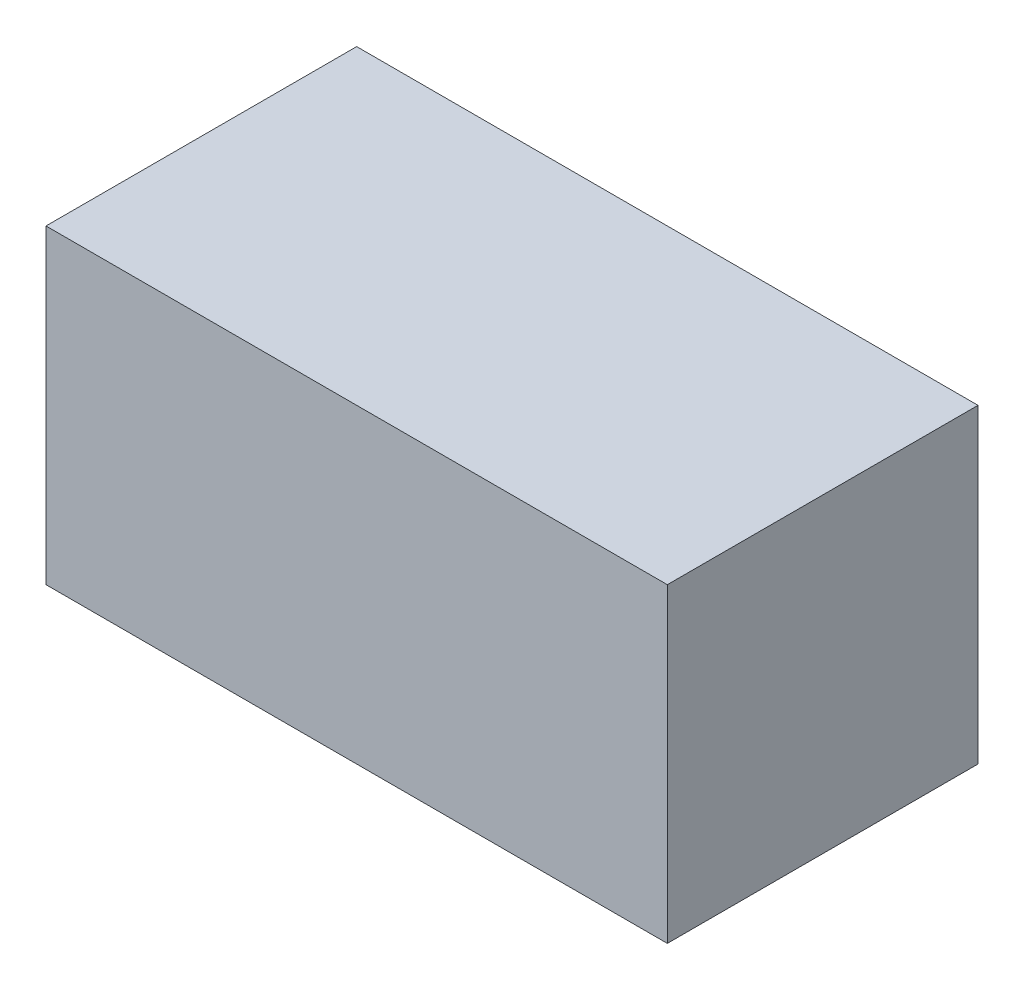
ISO-10303-21;
HEADER;
FILE_DESCRIPTION(('STEP AP214'),'2;1');
FILE_NAME('part.step','',(''),(''),'','','');
FILE_SCHEMA(('AUTOMOTIVE_DESIGN { 1 0 10303 214 1 1 1 1 }'));
ENDSEC;
DATA;
#1=APPLICATION_CONTEXT('core data for automotive mechanical design processes');
#2=APPLICATION_PROTOCOL_DEFINITION('international standard','automotive_design',2000,#1);
#3=PRODUCT_CONTEXT('',#1,'mechanical');
#4=PRODUCT('Part','Part','',(#3));
#5=PRODUCT_RELATED_PRODUCT_CATEGORY('part','',(#4));
#6=PRODUCT_DEFINITION_FORMATION('','',#4);
#7=PRODUCT_DEFINITION_CONTEXT('part definition',#1,'design');
#8=PRODUCT_DEFINITION('design','',#6,#7);
#9=PRODUCT_DEFINITION_SHAPE('','',#8);
#10=(LENGTH_UNIT() NAMED_UNIT(*) SI_UNIT(.MILLI.,.METRE.));
#11=(NAMED_UNIT(*) PLANE_ANGLE_UNIT() SI_UNIT($,.RADIAN.));
#12=(NAMED_UNIT(*) SI_UNIT($,.STERADIAN.) SOLID_ANGLE_UNIT());
#13=UNCERTAINTY_MEASURE_WITH_UNIT(LENGTH_MEASURE(1.E-05),#10,'distance_accuracy_value','');
#14=(GEOMETRIC_REPRESENTATION_CONTEXT(3) GLOBAL_UNCERTAINTY_ASSIGNED_CONTEXT((#13)) GLOBAL_UNIT_ASSIGNED_CONTEXT((#10,
#11,#12)) REPRESENTATION_CONTEXT('',''));
#15=CARTESIAN_POINT('',(0.,0.,0.));
#16=DIRECTION('',(0.,0.,1.));
#17=DIRECTION('',(1.,0.,0.));
#18=AXIS2_PLACEMENT_3D('',#15,#16,#17);
#19=CARTESIAN_POINT('',(0.,20.,10.));
#20=DIRECTION('',(1.,0.,0.));
#21=DIRECTION('',(0.,0.,-1.));
#22=AXIS2_PLACEMENT_3D('',#19,#20,#21);
#23=PLANE('',#22);
#24=DIRECTION('',(0.,-1.,0.));
#25=VECTOR('',#24,1.);
#26=CARTESIAN_POINT('',(0.,20.,-10.));
#27=LINE('',#26,#25);
#28=CARTESIAN_POINT('',(0.,20.,-10.));
#29=VERTEX_POINT('',#28);
#30=CARTESIAN_POINT('',(0.,0.,-10.));
#31=VERTEX_POINT('',#30);
#32=EDGE_CURVE('E104',#29,#31,#27,.T.);
#33=ORIENTED_EDGE('',*,*,#32,.T.);
#34=DIRECTION('',(0.,0.,-1.));
#35=VECTOR('',#34,1.);
#36=CARTESIAN_POINT('',(0.,0.,10.));
#37=LINE('',#36,#35);
#38=CARTESIAN_POINT('',(0.,0.,10.));
#39=VERTEX_POINT('',#38);
#40=EDGE_CURVE('E11',#39,#31,#37,.T.);
#41=ORIENTED_EDGE('',*,*,#40,.F.);
#42=DIRECTION('',(0.,-1.,0.));
#43=VECTOR('',#42,1.);
#44=CARTESIAN_POINT('',(0.,20.,10.));
#45=LINE('',#44,#43);
#46=CARTESIAN_POINT('',(0.,20.,10.));
#47=VERTEX_POINT('',#46);
#48=EDGE_CURVE('E92',#47,#39,#45,.T.);
#49=ORIENTED_EDGE('',*,*,#48,.F.);
#50=DIRECTION('',(0.,0.,-1.));
#51=VECTOR('',#50,1.);
#52=CARTESIAN_POINT('',(0.,20.,10.));
#53=LINE('',#52,#51);
#54=EDGE_CURVE('E100',#47,#29,#53,.T.);
#55=ORIENTED_EDGE('',*,*,#54,.T.);
#56=EDGE_LOOP('',(#33,#41,#49,#55));
#57=FACE_BOUND('',#56,.T.);
#58=ADVANCED_FACE('F41',(#57),#23,.F.);
#59=CARTESIAN_POINT('',(0.,0.,10.));
#60=DIRECTION('',(0.,1.,0.));
#61=DIRECTION('',(0.,0.,1.));
#62=AXIS2_PLACEMENT_3D('',#59,#60,#61);
#63=PLANE('',#62);
#64=DIRECTION('',(1.,0.,0.));
#65=VECTOR('',#64,1.);
#66=CARTESIAN_POINT('',(0.,0.,-10.));
#67=LINE('',#66,#65);
#68=CARTESIAN_POINT('',(40.,0.,-10.));
#69=VERTEX_POINT('',#68);
#70=EDGE_CURVE('E96',#31,#69,#67,.T.);
#71=ORIENTED_EDGE('',*,*,#70,.T.);
#72=DIRECTION('',(0.,0.,-1.));
#73=VECTOR('',#72,1.);
#74=CARTESIAN_POINT('',(40.,0.,10.));
#75=LINE('',#74,#73);
#76=CARTESIAN_POINT('',(40.,0.,10.));
#77=VERTEX_POINT('',#76);
#78=EDGE_CURVE('E49',#77,#69,#75,.T.);
#79=ORIENTED_EDGE('',*,*,#78,.F.);
#80=DIRECTION('',(1.,0.,0.));
#81=VECTOR('',#80,1.);
#82=CARTESIAN_POINT('',(0.,0.,10.));
#83=LINE('',#82,#81);
#84=EDGE_CURVE('E87',#39,#77,#83,.T.);
#85=ORIENTED_EDGE('',*,*,#84,.F.);
#86=ORIENTED_EDGE('',*,*,#40,.T.);
#87=EDGE_LOOP('',(#71,#79,#85,#86));
#88=FACE_BOUND('',#87,.T.);
#89=ADVANCED_FACE('F95',(#88),#63,.F.);
#90=CARTESIAN_POINT('',(40.,0.,10.));
#91=DIRECTION('',(-1.,0.,0.));
#92=DIRECTION('',(0.,0.,1.));
#93=AXIS2_PLACEMENT_3D('',#90,#91,#92);
#94=PLANE('',#93);
#95=DIRECTION('',(0.,1.,0.));
#96=VECTOR('',#95,1.);
#97=CARTESIAN_POINT('',(40.,0.,-10.));
#98=LINE('',#97,#96);
#99=CARTESIAN_POINT('',(40.,20.,-10.));
#100=VERTEX_POINT('',#99);
#101=EDGE_CURVE('E74',#69,#100,#98,.T.);
#102=ORIENTED_EDGE('',*,*,#101,.T.);
#103=DIRECTION('',(0.,0.,-1.));
#104=VECTOR('',#103,1.);
#105=CARTESIAN_POINT('',(40.,20.,10.));
#106=LINE('',#105,#104);
#107=CARTESIAN_POINT('',(40.,20.,10.));
#108=VERTEX_POINT('',#107);
#109=EDGE_CURVE('E97',#108,#100,#106,.T.);
#110=ORIENTED_EDGE('',*,*,#109,.F.);
#111=DIRECTION('',(0.,1.,0.));
#112=VECTOR('',#111,1.);
#113=CARTESIAN_POINT('',(40.,0.,10.));
#114=LINE('',#113,#112);
#115=EDGE_CURVE('E90',#77,#108,#114,.T.);
#116=ORIENTED_EDGE('',*,*,#115,.F.);
#117=ORIENTED_EDGE('',*,*,#78,.T.);
#118=EDGE_LOOP('',(#102,#110,#116,#117));
#119=FACE_BOUND('',#118,.T.);
#120=ADVANCED_FACE('F98',(#119),#94,.F.);
#121=CARTESIAN_POINT('',(40.,20.,10.));
#122=DIRECTION('',(0.,-1.,0.));
#123=DIRECTION('',(0.,0.,-1.));
#124=AXIS2_PLACEMENT_3D('',#121,#122,#123);
#125=PLANE('',#124);
#126=DIRECTION('',(-1.,0.,0.));
#127=VECTOR('',#126,1.);
#128=CARTESIAN_POINT('',(40.,20.,-10.));
#129=LINE('',#128,#127);
#130=EDGE_CURVE('E80',#100,#29,#129,.T.);
#131=ORIENTED_EDGE('',*,*,#130,.T.);
#132=ORIENTED_EDGE('',*,*,#54,.F.);
#133=DIRECTION('',(-1.,0.,0.));
#134=VECTOR('',#133,1.);
#135=CARTESIAN_POINT('',(40.,20.,10.));
#136=LINE('',#135,#134);
#137=EDGE_CURVE('E57',#108,#47,#136,.T.);
#138=ORIENTED_EDGE('',*,*,#137,.F.);
#139=ORIENTED_EDGE('',*,*,#109,.T.);
#140=EDGE_LOOP('',(#131,#132,#138,#139));
#141=FACE_BOUND('',#140,.T.);
#142=ADVANCED_FACE('F112',(#141),#125,.F.);
#143=CARTESIAN_POINT('',(0.,0.,10.));
#144=DIRECTION('',(0.,0.,1.));
#145=DIRECTION('',(1.,0.,0.));
#146=AXIS2_PLACEMENT_3D('',#143,#144,#145);
#147=PLANE('',#146);
#148=ORIENTED_EDGE('',*,*,#48,.T.);
#149=ORIENTED_EDGE('',*,*,#84,.T.);
#150=ORIENTED_EDGE('',*,*,#115,.T.);
#151=ORIENTED_EDGE('',*,*,#137,.T.);
#152=EDGE_LOOP('',(#148,#149,#150,#151));
#153=FACE_BOUND('',#152,.T.);
#154=ADVANCED_FACE('F88',(#153),#147,.T.);
#155=CARTESIAN_POINT('',(0.,0.,-10.));
#156=DIRECTION('',(0.,0.,1.));
#157=DIRECTION('',(1.,0.,0.));
#158=AXIS2_PLACEMENT_3D('',#155,#156,#157);
#159=PLANE('',#158);
#160=CARTESIAN_POINT('',(20.,10.,-10.));
#161=DIRECTION('',(0.,0.,1.));
#162=DIRECTION('',(1.,0.,0.));
#163=AXIS2_PLACEMENT_3D('',#160,#161,#162);
#164=CIRCLE('',#163,4.);
#165=CARTESIAN_POINT('',(24.,10.,-10.));
#166=VERTEX_POINT('',#165);
#167=EDGE_CURVE('E107',#166,#166,#164,.T.);
#168=ORIENTED_EDGE('',*,*,#167,.T.);
#169=EDGE_LOOP('',(#168));
#170=FACE_BOUND('',#169,.T.);
#171=ORIENTED_EDGE('',*,*,#32,.F.);
#172=ORIENTED_EDGE('',*,*,#130,.F.);
#173=ORIENTED_EDGE('',*,*,#101,.F.);
#174=ORIENTED_EDGE('',*,*,#70,.F.);
#175=EDGE_LOOP('',(#171,#172,#173,#174));
#176=FACE_BOUND('',#175,.T.);
#177=ADVANCED_FACE('F115',(#170,#176),#159,.F.);
#178=CARTESIAN_POINT('',(20.,10.,-10.));
#179=DIRECTION('',(0.,0.,1.));
#180=DIRECTION('',(1.,0.,0.));
#181=AXIS2_PLACEMENT_3D('',#178,#179,#180);
#182=CYLINDRICAL_SURFACE('',#181,4.);
#183=ORIENTED_EDGE('',*,*,#167,.F.);
#184=EDGE_LOOP('',(#183));
#185=FACE_BOUND('',#184,.T.);
#186=CARTESIAN_POINT('',(20.,10.,0.));
#187=DIRECTION('',(0.,0.,1.));
#188=DIRECTION('',(1.,0.,0.));
#189=AXIS2_PLACEMENT_3D('',#186,#187,#188);
#190=CIRCLE('',#189,4.);
#191=CARTESIAN_POINT('',(24.,10.,0.));
#192=VERTEX_POINT('',#191);
#193=EDGE_CURVE('E118',#192,#192,#190,.T.);
#194=ORIENTED_EDGE('',*,*,#193,.T.);
#195=EDGE_LOOP('',(#194));
#196=FACE_BOUND('',#195,.T.);
#197=ADVANCED_FACE('F125',(#185,#196),#182,.F.);
#198=CARTESIAN_POINT('',(20.,10.,0.));
#199=DIRECTION('',(0.,0.,1.));
#200=DIRECTION('',(1.,0.,0.));
#201=AXIS2_PLACEMENT_3D('',#198,#199,#200);
#202=PLANE('',#201);
#203=ORIENTED_EDGE('',*,*,#193,.F.);
#204=EDGE_LOOP('',(#203));
#205=FACE_BOUND('',#204,.T.);
#206=ADVANCED_FACE('F128',(#205),#202,.F.);
#207=CLOSED_SHELL('',(#58,#89,#120,#142,#154,#177,#197,#206));
#208=MANIFOLD_SOLID_BREP('B2',#207);
#209=ADVANCED_BREP_SHAPE_REPRESENTATION('',(#18,#208),#14);
#210=SHAPE_DEFINITION_REPRESENTATION(#9,#209);
ENDSEC;
END-ISO-10303-21;
